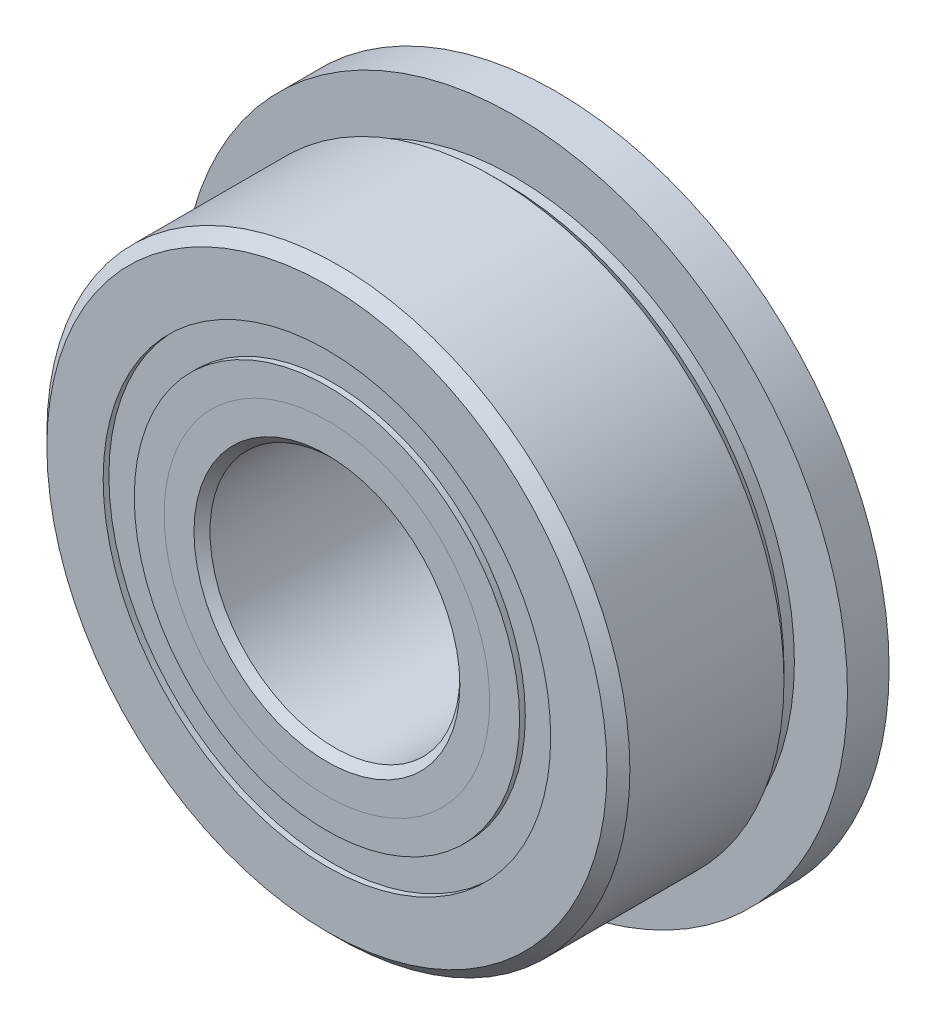
ISO-10303-21;
HEADER;
FILE_DESCRIPTION(('STEP AP214'),'2;1');
FILE_NAME('part.step','',(''),(''),'','','');
FILE_SCHEMA(('AUTOMOTIVE_DESIGN { 1 0 10303 214 1 1 1 1 }'));
ENDSEC;
DATA;
#1=APPLICATION_CONTEXT('core data for automotive mechanical design processes');
#2=APPLICATION_PROTOCOL_DEFINITION('international standard','automotive_design',2000,#1);
#3=PRODUCT_CONTEXT('',#1,'mechanical');
#4=PRODUCT('Part','Part','',(#3));
#5=PRODUCT_RELATED_PRODUCT_CATEGORY('part','',(#4));
#6=PRODUCT_DEFINITION_FORMATION('','',#4);
#7=PRODUCT_DEFINITION_CONTEXT('part definition',#1,'design');
#8=PRODUCT_DEFINITION('design','',#6,#7);
#9=PRODUCT_DEFINITION_SHAPE('','',#8);
#10=(LENGTH_UNIT() NAMED_UNIT(*) SI_UNIT(.MILLI.,.METRE.));
#11=(NAMED_UNIT(*) PLANE_ANGLE_UNIT() SI_UNIT($,.RADIAN.));
#12=(NAMED_UNIT(*) SI_UNIT($,.STERADIAN.) SOLID_ANGLE_UNIT());
#13=UNCERTAINTY_MEASURE_WITH_UNIT(LENGTH_MEASURE(1.E-05),#10,'distance_accuracy_value','');
#14=(GEOMETRIC_REPRESENTATION_CONTEXT(3) GLOBAL_UNCERTAINTY_ASSIGNED_CONTEXT((#13)) GLOBAL_UNIT_ASSIGNED_CONTEXT((#10,
#11,#12)) REPRESENTATION_CONTEXT('',''));
#15=CARTESIAN_POINT('',(0.,0.,0.));
#16=DIRECTION('',(0.,0.,1.));
#17=DIRECTION('',(1.,0.,0.));
#18=AXIS2_PLACEMENT_3D('',#15,#16,#17);
#19=CARTESIAN_POINT('',(0.,8.53063186813187,-4.14734375));
#20=DIRECTION('',(0.,0.,1.));
#21=DIRECTION('',(1.,0.,0.));
#22=AXIS2_PLACEMENT_3D('',#19,#20,#21);
#23=PLANE('',#22);
#24=CARTESIAN_POINT('',(0.,0.,-4.14734375));
#25=DIRECTION('',(0.,0.,1.));
#26=DIRECTION('',(1.,0.,0.));
#27=AXIS2_PLACEMENT_3D('',#24,#25,#26);
#28=CIRCLE('',#27,8.53063186813187);
#29=CARTESIAN_POINT('',(8.53063186813187,0.,-4.14734375));
#30=VERTEX_POINT('',#29);
#31=EDGE_CURVE('E60',#30,#30,#28,.T.);
#32=ORIENTED_EDGE('',*,*,#31,.F.);
#33=EDGE_LOOP('',(#32));
#34=FACE_BOUND('',#33,.T.);
#35=CARTESIAN_POINT('',(0.,0.,-4.14734375));
#36=DIRECTION('',(0.,0.,1.));
#37=DIRECTION('',(1.,0.,0.));
#38=AXIS2_PLACEMENT_3D('',#35,#36,#37);
#39=CIRCLE('',#38,5.9563);
#40=CARTESIAN_POINT('',(5.9563,0.,-4.14734375));
#41=VERTEX_POINT('',#40);
#42=EDGE_CURVE('E11',#41,#41,#39,.T.);
#43=ORIENTED_EDGE('',*,*,#42,.T.);
#44=EDGE_LOOP('',(#43));
#45=FACE_BOUND('',#44,.T.);
#46=ADVANCED_FACE('F46',(#34,#45),#23,.F.);
#47=CARTESIAN_POINT('',(0.,0.,4.365625));
#48=DIRECTION('',(0.,0.,1.));
#49=DIRECTION('',(1.,0.,0.));
#50=AXIS2_PLACEMENT_3D('',#47,#48,#49);
#51=CYLINDRICAL_SURFACE('',#50,5.9563);
#52=ORIENTED_EDGE('',*,*,#42,.F.);
#53=EDGE_LOOP('',(#52));
#54=FACE_BOUND('',#53,.T.);
#55=CARTESIAN_POINT('',(0.,0.,-2.56418571825199));
#56=DIRECTION('',(0.,0.,1.));
#57=DIRECTION('',(1.,0.,0.));
#58=AXIS2_PLACEMENT_3D('',#55,#56,#57);
#59=CIRCLE('',#58,5.9563);
#60=CARTESIAN_POINT('',(5.9563,0.,-2.56418571825199));
#61=VERTEX_POINT('',#60);
#62=EDGE_CURVE('E52',#61,#61,#59,.T.);
#63=ORIENTED_EDGE('',*,*,#62,.T.);
#64=EDGE_LOOP('',(#63));
#65=FACE_BOUND('',#64,.T.);
#66=ADVANCED_FACE('F69',(#54,#65),#51,.F.);
#67=CARTESIAN_POINT('',(0.,8.53063186813187,-2.56418571825199));
#68=DIRECTION('',(0.,0.,-1.));
#69=DIRECTION('',(-1.,0.,0.));
#70=AXIS2_PLACEMENT_3D('',#67,#68,#69);
#71=PLANE('',#70);
#72=ORIENTED_EDGE('',*,*,#62,.F.);
#73=EDGE_LOOP('',(#72));
#74=FACE_BOUND('',#73,.T.);
#75=CARTESIAN_POINT('',(0.,0.,-2.56418571825199));
#76=DIRECTION('',(0.,0.,1.));
#77=DIRECTION('',(1.,0.,0.));
#78=AXIS2_PLACEMENT_3D('',#75,#76,#77);
#79=CIRCLE('',#78,8.53063186813187);
#80=CARTESIAN_POINT('',(8.53063186813187,0.,-2.56418571825199));
#81=VERTEX_POINT('',#80);
#82=EDGE_CURVE('E56',#81,#81,#79,.T.);
#83=ORIENTED_EDGE('',*,*,#82,.T.);
#84=EDGE_LOOP('',(#83));
#85=FACE_BOUND('',#84,.T.);
#86=ADVANCED_FACE('F73',(#74,#85),#71,.F.);
#87=CARTESIAN_POINT('',(0.,0.,4.365625));
#88=DIRECTION('',(0.,0.,1.));
#89=DIRECTION('',(1.,0.,0.));
#90=AXIS2_PLACEMENT_3D('',#87,#88,#89);
#91=CYLINDRICAL_SURFACE('',#90,8.53063186813187);
#92=ORIENTED_EDGE('',*,*,#82,.F.);
#93=EDGE_LOOP('',(#92));
#94=FACE_BOUND('',#93,.T.);
#95=ORIENTED_EDGE('',*,*,#31,.T.);
#96=EDGE_LOOP('',(#95));
#97=FACE_BOUND('',#96,.T.);
#98=ADVANCED_FACE('F66',(#94,#97),#91,.T.);
#99=CLOSED_SHELL('',(#46,#66,#86,#98));
#100=MANIFOLD_SOLID_BREP('B2',#99);
#101=CARTESIAN_POINT('',(0.,8.53063186813187,4.14734375));
#102=DIRECTION('',(0.,0.,-1.));
#103=DIRECTION('',(-1.,0.,0.));
#104=AXIS2_PLACEMENT_3D('',#101,#102,#103);
#105=PLANE('',#104);
#106=CARTESIAN_POINT('',(0.,0.,4.14734375));
#107=DIRECTION('',(0.,0.,1.));
#108=DIRECTION('',(1.,0.,0.));
#109=AXIS2_PLACEMENT_3D('',#106,#107,#108);
#110=CIRCLE('',#109,7.34436813186813);
#111=CARTESIAN_POINT('',(7.34436813186813,0.,4.14734375));
#112=VERTEX_POINT('',#111);
#113=EDGE_CURVE('E45',#112,#112,#110,.T.);
#114=ORIENTED_EDGE('',*,*,#113,.F.);
#115=EDGE_LOOP('',(#114));
#116=FACE_BOUND('',#115,.T.);
#117=CARTESIAN_POINT('',(0.,0.,4.14734375));
#118=DIRECTION('',(0.,0.,1.));
#119=DIRECTION('',(1.,0.,0.));
#120=AXIS2_PLACEMENT_3D('',#117,#118,#119);
#121=CIRCLE('',#120,8.53063186813187);
#122=CARTESIAN_POINT('',(8.53063186813187,0.,4.14734375));
#123=VERTEX_POINT('',#122);
#124=EDGE_CURVE('E130',#123,#123,#121,.T.);
#125=ORIENTED_EDGE('',*,*,#124,.T.);
#126=EDGE_LOOP('',(#125));
#127=FACE_BOUND('',#126,.T.);
#128=ADVANCED_FACE('F116',(#116,#127),#105,.F.);
#129=CARTESIAN_POINT('',(0.,0.,4.365625));
#130=DIRECTION('',(0.,0.,1.));
#131=DIRECTION('',(1.,0.,0.));
#132=AXIS2_PLACEMENT_3D('',#129,#130,#131);
#133=CYLINDRICAL_SURFACE('',#132,7.34436813186813);
#134=CARTESIAN_POINT('',(0.,0.,2.56418571825199));
#135=DIRECTION('',(0.,0.,1.));
#136=DIRECTION('',(1.,0.,0.));
#137=AXIS2_PLACEMENT_3D('',#134,#135,#136);
#138=CIRCLE('',#137,7.34436813186813);
#139=CARTESIAN_POINT('',(7.34436813186813,0.,2.56418571825199));
#140=VERTEX_POINT('',#139);
#141=EDGE_CURVE('E122',#140,#140,#138,.T.);
#142=ORIENTED_EDGE('',*,*,#141,.F.);
#143=EDGE_LOOP('',(#142));
#144=FACE_BOUND('',#143,.T.);
#145=ORIENTED_EDGE('',*,*,#113,.T.);
#146=EDGE_LOOP('',(#145));
#147=FACE_BOUND('',#146,.T.);
#148=ADVANCED_FACE('F145',(#144,#147),#133,.F.);
#149=CARTESIAN_POINT('',(0.,8.53063186813187,2.56418571825199));
#150=DIRECTION('',(0.,0.,1.));
#151=DIRECTION('',(1.,0.,0.));
#152=AXIS2_PLACEMENT_3D('',#149,#150,#151);
#153=PLANE('',#152);
#154=CARTESIAN_POINT('',(0.,0.,2.56418571825199));
#155=DIRECTION('',(0.,0.,1.));
#156=DIRECTION('',(1.,0.,0.));
#157=AXIS2_PLACEMENT_3D('',#154,#155,#156);
#158=CIRCLE('',#157,8.53063186813187);
#159=CARTESIAN_POINT('',(8.53063186813187,0.,2.56418571825199));
#160=VERTEX_POINT('',#159);
#161=EDGE_CURVE('E126',#160,#160,#158,.T.);
#162=ORIENTED_EDGE('',*,*,#161,.F.);
#163=EDGE_LOOP('',(#162));
#164=FACE_BOUND('',#163,.T.);
#165=ORIENTED_EDGE('',*,*,#141,.T.);
#166=EDGE_LOOP('',(#165));
#167=FACE_BOUND('',#166,.T.);
#168=ADVANCED_FACE('F140',(#164,#167),#153,.F.);
#169=CARTESIAN_POINT('',(0.,0.,4.365625));
#170=DIRECTION('',(0.,0.,1.));
#171=DIRECTION('',(1.,0.,0.));
#172=AXIS2_PLACEMENT_3D('',#169,#170,#171);
#173=CYLINDRICAL_SURFACE('',#172,8.53063186813187);
#174=ORIENTED_EDGE('',*,*,#124,.F.);
#175=EDGE_LOOP('',(#174));
#176=FACE_BOUND('',#175,.T.);
#177=ORIENTED_EDGE('',*,*,#161,.T.);
#178=EDGE_LOOP('',(#177));
#179=FACE_BOUND('',#178,.T.);
#180=ADVANCED_FACE('F137',(#176,#179),#173,.T.);
#181=CLOSED_SHELL('',(#128,#148,#168,#180));
#182=MANIFOLD_SOLID_BREP('B6',#181);
#183=CARTESIAN_POINT('',(-3.96874999999991,6.87407664253903,0.));
#184=DIRECTION('',(0.,0.,1.));
#185=DIRECTION('',(-0.499999999999989,0.866025403784445,0.));
#186=AXIS2_PLACEMENT_3D('',#183,#184,#185);
#187=SPHERICAL_SURFACE('',#186,2.56418571825199);
#188=CARTESIAN_POINT('',(-3.96874999999991,6.87407664253903,2.56418571825199));
#189=VERTEX_POINT('',#188);
#190=VERTEX_LOOP('',#189);
#191=FACE_BOUND('',#190,.T.);
#192=ADVANCED_FACE('F186',(#191),#187,.T.);
#193=CLOSED_SHELL('',(#192));
#194=MANIFOLD_SOLID_BREP('B40',#193);
#195=CARTESIAN_POINT('',(-6.87407664253894,3.96875000000008,0.));
#196=DIRECTION('',(0.,0.,1.));
#197=DIRECTION('',(-0.866025403784433,0.50000000000001,0.));
#198=AXIS2_PLACEMENT_3D('',#195,#196,#197);
#199=SPHERICAL_SURFACE('',#198,2.56418571825199);
#200=CARTESIAN_POINT('',(-6.87407664253894,3.96875000000008,2.56418571825199));
#201=VERTEX_POINT('',#200);
#202=VERTEX_LOOP('',#201);
#203=FACE_BOUND('',#202,.T.);
#204=ADVANCED_FACE('F221',(#203),#199,.T.);
#205=CLOSED_SHELL('',(#204));
#206=MANIFOLD_SOLID_BREP('B112',#205);
#207=CARTESIAN_POINT('',(-7.9375,0.,0.));
#208=DIRECTION('',(0.,0.,1.));
#209=DIRECTION('',(-1.,0.,0.));
#210=AXIS2_PLACEMENT_3D('',#207,#208,#209);
#211=SPHERICAL_SURFACE('',#210,2.56418571825199);
#212=CARTESIAN_POINT('',(-7.9375,0.,2.56418571825199));
#213=VERTEX_POINT('',#212);
#214=VERTEX_LOOP('',#213);
#215=FACE_BOUND('',#214,.T.);
#216=ADVANCED_FACE('F256',(#215),#211,.T.);
#217=CLOSED_SHELL('',(#216));
#218=MANIFOLD_SOLID_BREP('B182',#217);
#219=CARTESIAN_POINT('',(-6.87407664253902,-3.96874999999994,0.));
#220=DIRECTION('',(0.,0.,1.));
#221=DIRECTION('',(-0.866025403784443,-0.499999999999992,0.));
#222=AXIS2_PLACEMENT_3D('',#219,#220,#221);
#223=SPHERICAL_SURFACE('',#222,2.56418571825199);
#224=CARTESIAN_POINT('',(-6.87407664253902,-3.96874999999994,2.56418571825199));
#225=VERTEX_POINT('',#224);
#226=VERTEX_LOOP('',#225);
#227=FACE_BOUND('',#226,.T.);
#228=ADVANCED_FACE('F291',(#227),#223,.T.);
#229=CLOSED_SHELL('',(#228));
#230=MANIFOLD_SOLID_BREP('B217',#229);
#231=CARTESIAN_POINT('',(-3.96875000000006,-6.87407664253895,0.));
#232=DIRECTION('',(0.,0.,1.));
#233=DIRECTION('',(-0.500000000000007,-0.866025403784435,0.));
#234=AXIS2_PLACEMENT_3D('',#231,#232,#233);
#235=SPHERICAL_SURFACE('',#234,2.56418571825199);
#236=CARTESIAN_POINT('',(-3.96875000000006,-6.87407664253895,2.56418571825199));
#237=VERTEX_POINT('',#236);
#238=VERTEX_LOOP('',#237);
#239=FACE_BOUND('',#238,.T.);
#240=ADVANCED_FACE('F323',(#239),#235,.T.);
#241=CLOSED_SHELL('',(#240));
#242=MANIFOLD_SOLID_BREP('B252',#241);
#243=CARTESIAN_POINT('',(0.,-7.9375,0.));
#244=DIRECTION('',(0.,0.,1.));
#245=DIRECTION('',(0.,-1.,0.));
#246=AXIS2_PLACEMENT_3D('',#243,#244,#245);
#247=SPHERICAL_SURFACE('',#246,2.56418571825199);
#248=CARTESIAN_POINT('',(0.,-7.9375,2.56418571825199));
#249=VERTEX_POINT('',#248);
#250=VERTEX_LOOP('',#249);
#251=FACE_BOUND('',#250,.T.);
#252=ADVANCED_FACE('F352',(#251),#247,.T.);
#253=CLOSED_SHELL('',(#252));
#254=MANIFOLD_SOLID_BREP('B287',#253);
#255=CARTESIAN_POINT('',(3.96874999999996,-6.87407664253901,0.));
#256=DIRECTION('',(0.,0.,1.));
#257=DIRECTION('',(0.499999999999995,-0.866025403784442,0.));
#258=AXIS2_PLACEMENT_3D('',#255,#256,#257);
#259=SPHERICAL_SURFACE('',#258,2.56418571825199);
#260=CARTESIAN_POINT('',(3.96874999999996,-6.87407664253901,2.56418571825199));
#261=VERTEX_POINT('',#260);
#262=VERTEX_LOOP('',#261);
#263=FACE_BOUND('',#262,.T.);
#264=ADVANCED_FACE('F381',(#263),#259,.T.);
#265=CLOSED_SHELL('',(#264));
#266=MANIFOLD_SOLID_BREP('B319',#265);
#267=CARTESIAN_POINT('',(6.87407664253896,-3.96875000000003,0.));
#268=DIRECTION('',(0.,0.,1.));
#269=DIRECTION('',(0.866025403784436,-0.500000000000004,0.));
#270=AXIS2_PLACEMENT_3D('',#267,#268,#269);
#271=SPHERICAL_SURFACE('',#270,2.56418571825199);
#272=CARTESIAN_POINT('',(6.87407664253896,-3.96875000000003,2.56418571825199));
#273=VERTEX_POINT('',#272);
#274=VERTEX_LOOP('',#273);
#275=FACE_BOUND('',#274,.T.);
#276=ADVANCED_FACE('F410',(#275),#271,.T.);
#277=CLOSED_SHELL('',(#276));
#278=MANIFOLD_SOLID_BREP('B348',#277);
#279=CARTESIAN_POINT('',(7.9375,0.,0.));
#280=DIRECTION('',(0.,0.,1.));
#281=DIRECTION('',(1.,0.,0.));
#282=AXIS2_PLACEMENT_3D('',#279,#280,#281);
#283=SPHERICAL_SURFACE('',#282,2.56418571825199);
#284=CARTESIAN_POINT('',(7.9375,0.,2.56418571825199));
#285=VERTEX_POINT('',#284);
#286=VERTEX_LOOP('',#285);
#287=FACE_BOUND('',#286,.T.);
#288=ADVANCED_FACE('F442',(#287),#283,.T.);
#289=CLOSED_SHELL('',(#288));
#290=MANIFOLD_SOLID_BREP('B377',#289);
#291=CARTESIAN_POINT('',(6.87407664253899,3.96874999999998,0.));
#292=DIRECTION('',(0.,0.,1.));
#293=DIRECTION('',(0.86602540378444,0.499999999999998,0.));
#294=AXIS2_PLACEMENT_3D('',#291,#292,#293);
#295=SPHERICAL_SURFACE('',#294,2.56418571825199);
#296=CARTESIAN_POINT('',(6.87407664253899,3.96874999999998,2.56418571825199));
#297=VERTEX_POINT('',#296);
#298=VERTEX_LOOP('',#297);
#299=FACE_BOUND('',#298,.T.);
#300=ADVANCED_FACE('F477',(#299),#295,.T.);
#301=CLOSED_SHELL('',(#300));
#302=MANIFOLD_SOLID_BREP('B406',#301);
#303=CARTESIAN_POINT('',(3.96875000000001,6.87407664253898,0.));
#304=DIRECTION('',(0.,0.,1.));
#305=DIRECTION('',(0.500000000000001,0.866025403784438,0.));
#306=AXIS2_PLACEMENT_3D('',#303,#304,#305);
#307=SPHERICAL_SURFACE('',#306,2.56418571825199);
#308=CARTESIAN_POINT('',(3.96875000000001,6.87407664253898,2.56418571825199));
#309=VERTEX_POINT('',#308);
#310=VERTEX_LOOP('',#309);
#311=FACE_BOUND('',#310,.T.);
#312=ADVANCED_FACE('F509',(#311),#307,.T.);
#313=CLOSED_SHELL('',(#312));
#314=MANIFOLD_SOLID_BREP('B438',#313);
#315=CARTESIAN_POINT('',(0.,7.9375,0.));
#316=DIRECTION('',(0.,0.,1.));
#317=DIRECTION('',(0.,1.,0.));
#318=AXIS2_PLACEMENT_3D('',#315,#316,#317);
#319=SPHERICAL_SURFACE('',#318,2.56418571825199);
#320=CARTESIAN_POINT('',(0.,7.9375,2.56418571825199));
#321=VERTEX_POINT('',#320);
#322=VERTEX_LOOP('',#321);
#323=FACE_BOUND('',#322,.T.);
#324=ADVANCED_FACE('F543',(#323),#319,.T.);
#325=CLOSED_SHELL('',(#324));
#326=MANIFOLD_SOLID_BREP('B473',#325);
#327=CARTESIAN_POINT('',(0.,6.20613763637107,4.365625));
#328=DIRECTION('',(0.,0.,-1.));
#329=DIRECTION('',(-1.,0.,0.));
#330=AXIS2_PLACEMENT_3D('',#327,#328,#329);
#331=PLANE('',#330);
#332=CARTESIAN_POINT('',(0.,0.,4.365625));
#333=DIRECTION('',(0.,0.,1.));
#334=DIRECTION('',(1.,0.,0.));
#335=AXIS2_PLACEMENT_3D('',#332,#333,#334);
#336=CIRCLE('',#335,5.067907140874);
#337=CARTESIAN_POINT('',(5.067907140874,0.,4.365625));
#338=VERTEX_POINT('',#337);
#339=EDGE_CURVE('E600',#338,#338,#336,.T.);
#340=ORIENTED_EDGE('',*,*,#339,.F.);
#341=EDGE_LOOP('',(#340));
#342=FACE_BOUND('',#341,.T.);
#343=CARTESIAN_POINT('',(0.,0.,4.365625));
#344=DIRECTION('',(0.,0.,1.));
#345=DIRECTION('',(1.,0.,0.));
#346=AXIS2_PLACEMENT_3D('',#343,#344,#345);
#347=CIRCLE('',#346,6.20613763637107);
#348=CARTESIAN_POINT('',(6.20613763637107,0.,4.365625));
#349=VERTEX_POINT('',#348);
#350=EDGE_CURVE('E542',#349,#349,#347,.T.);
#351=ORIENTED_EDGE('',*,*,#350,.T.);
#352=EDGE_LOOP('',(#351));
#353=FACE_BOUND('',#352,.T.);
#354=ADVANCED_FACE('F566',(#342,#353),#331,.F.);
#355=CARTESIAN_POINT('',(0.,0.,3.22739450450294));
#356=DIRECTION('',(0.,0.,1.));
#357=DIRECTION('',(1.,0.,0.));
#358=AXIS2_PLACEMENT_3D('',#355,#356,#357);
#359=CONICAL_SURFACE('',#358,5.067907140874,0.78539816339745);
#360=ORIENTED_EDGE('',*,*,#350,.F.);
#361=EDGE_LOOP('',(#360));
#362=FACE_BOUND('',#361,.T.);
#363=CARTESIAN_POINT('',(0.,0.,3.22739450450294));
#364=DIRECTION('',(0.,0.,1.));
#365=DIRECTION('',(1.,0.,0.));
#366=AXIS2_PLACEMENT_3D('',#363,#364,#365);
#367=CIRCLE('',#366,5.067907140874);
#368=CARTESIAN_POINT('',(5.067907140874,0.,3.22739450450294));
#369=VERTEX_POINT('',#368);
#370=EDGE_CURVE('E572',#369,#369,#367,.T.);
#371=ORIENTED_EDGE('',*,*,#370,.T.);
#372=EDGE_LOOP('',(#371));
#373=FACE_BOUND('',#372,.T.);
#374=ADVANCED_FACE('F607',(#362,#373),#359,.T.);
#375=CARTESIAN_POINT('',(0.,0.,4.365625));
#376=DIRECTION('',(0.,0.,1.));
#377=DIRECTION('',(1.,0.,0.));
#378=AXIS2_PLACEMENT_3D('',#375,#376,#377);
#379=CYLINDRICAL_SURFACE('',#378,5.067907140874);
#380=ORIENTED_EDGE('',*,*,#370,.F.);
#381=EDGE_LOOP('',(#380));
#382=FACE_BOUND('',#381,.T.);
#383=CARTESIAN_POINT('',(0.,0.,0.));
#384=DIRECTION('',(0.,0.,1.));
#385=DIRECTION('',(1.,0.,0.));
#386=AXIS2_PLACEMENT_3D('',#383,#384,#385);
#387=CIRCLE('',#386,5.067907140874);
#388=CARTESIAN_POINT('',(5.067907140874,0.,0.));
#389=VERTEX_POINT('',#388);
#390=EDGE_CURVE('E576',#389,#389,#387,.T.);
#391=ORIENTED_EDGE('',*,*,#390,.T.);
#392=EDGE_LOOP('',(#391));
#393=FACE_BOUND('',#392,.T.);
#394=ADVANCED_FACE('F611',(#382,#393),#379,.T.);
#395=CARTESIAN_POINT('',(0.,5.067907140874,0.));
#396=DIRECTION('',(0.,0.,-1.));
#397=DIRECTION('',(-1.,0.,0.));
#398=AXIS2_PLACEMENT_3D('',#395,#396,#397);
#399=PLANE('',#398);
#400=ORIENTED_EDGE('',*,*,#390,.F.);
#401=EDGE_LOOP('',(#400));
#402=FACE_BOUND('',#401,.T.);
#403=CARTESIAN_POINT('',(0.,0.,0.));
#404=DIRECTION('',(0.,0.,1.));
#405=DIRECTION('',(1.,0.,0.));
#406=AXIS2_PLACEMENT_3D('',#403,#404,#405);
#407=CIRCLE('',#406,5.37331428174801);
#408=CARTESIAN_POINT('',(5.37331428174801,0.,0.));
#409=VERTEX_POINT('',#408);
#410=EDGE_CURVE('E580',#409,#409,#407,.T.);
#411=ORIENTED_EDGE('',*,*,#410,.T.);
#412=EDGE_LOOP('',(#411));
#413=FACE_BOUND('',#412,.T.);
#414=ADVANCED_FACE('F616',(#402,#413),#399,.F.);
#415=CARTESIAN_POINT('',(0.,0.,0.));
#416=DIRECTION('',(0.,0.,1.));
#417=DIRECTION('',(1.,0.,0.));
#418=AXIS2_PLACEMENT_3D('',#415,#416,#417);
#419=TOROIDAL_SURFACE('',#418,7.9375,2.56418571825199);
#420=ORIENTED_EDGE('',*,*,#410,.F.);
#421=EDGE_LOOP('',(#420));
#422=FACE_BOUND('',#421,.T.);
#423=CARTESIAN_POINT('',(0.,0.,-1.62784979580042));
#424=DIRECTION('',(0.,0.,1.));
#425=DIRECTION('',(1.,0.,0.));
#426=AXIS2_PLACEMENT_3D('',#423,#424,#425);
#427=CIRCLE('',#426,5.9563);
#428=CARTESIAN_POINT('',(5.9563,0.,-1.62784979580042));
#429=VERTEX_POINT('',#428);
#430=EDGE_CURVE('E585',#429,#429,#427,.T.);
#431=ORIENTED_EDGE('',*,*,#430,.T.);
#432=EDGE_LOOP('',(#431));
#433=FACE_BOUND('',#432,.T.);
#434=ADVANCED_FACE('F622',(#422,#433),#419,.F.);
#435=CARTESIAN_POINT('',(0.,0.,4.365625));
#436=DIRECTION('',(0.,0.,1.));
#437=DIRECTION('',(1.,0.,0.));
#438=AXIS2_PLACEMENT_3D('',#435,#436,#437);
#439=CYLINDRICAL_SURFACE('',#438,5.9563);
#440=ORIENTED_EDGE('',*,*,#430,.F.);
#441=EDGE_LOOP('',(#440));
#442=FACE_BOUND('',#441,.T.);
#443=CARTESIAN_POINT('',(0.,0.,-5.953125));
#444=DIRECTION('',(0.,0.,1.));
#445=DIRECTION('',(1.,0.,0.));
#446=AXIS2_PLACEMENT_3D('',#443,#444,#445);
#447=CIRCLE('',#446,5.9563);
#448=CARTESIAN_POINT('',(5.9563,0.,-5.953125));
#449=VERTEX_POINT('',#448);
#450=EDGE_CURVE('E588',#449,#449,#447,.T.);
#451=ORIENTED_EDGE('',*,*,#450,.T.);
#452=EDGE_LOOP('',(#451));
#453=FACE_BOUND('',#452,.T.);
#454=ADVANCED_FACE('F626',(#442,#453),#439,.T.);
#455=CARTESIAN_POINT('',(0.,5.1990625,-5.953125));
#456=DIRECTION('',(0.,0.,1.));
#457=DIRECTION('',(1.,0.,0.));
#458=AXIS2_PLACEMENT_3D('',#455,#456,#457);
#459=PLANE('',#458);
#460=ORIENTED_EDGE('',*,*,#450,.F.);
#461=EDGE_LOOP('',(#460));
#462=FACE_BOUND('',#461,.T.);
#463=CARTESIAN_POINT('',(0.,0.,-5.953125));
#464=DIRECTION('',(0.,0.,1.));
#465=DIRECTION('',(1.,0.,0.));
#466=AXIS2_PLACEMENT_3D('',#463,#464,#465);
#467=CIRCLE('',#466,5.1990625);
#468=CARTESIAN_POINT('',(5.1990625,0.,-5.953125));
#469=VERTEX_POINT('',#468);
#470=EDGE_CURVE('E591',#469,#469,#467,.T.);
#471=ORIENTED_EDGE('',*,*,#470,.T.);
#472=EDGE_LOOP('',(#471));
#473=FACE_BOUND('',#472,.T.);
#474=ADVANCED_FACE('F630',(#462,#473),#459,.F.);
#475=CARTESIAN_POINT('',(0.,0.,-5.5165625));
#476=DIRECTION('',(0.,0.,-1.));
#477=DIRECTION('',(-1.,0.,0.));
#478=AXIS2_PLACEMENT_3D('',#475,#476,#477);
#479=CONICAL_SURFACE('',#478,4.7625,0.785398163397444);
#480=ORIENTED_EDGE('',*,*,#470,.F.);
#481=EDGE_LOOP('',(#480));
#482=FACE_BOUND('',#481,.T.);
#483=CARTESIAN_POINT('',(0.,0.,-5.5165625));
#484=DIRECTION('',(0.,0.,1.));
#485=DIRECTION('',(1.,0.,0.));
#486=AXIS2_PLACEMENT_3D('',#483,#484,#485);
#487=CIRCLE('',#486,4.7625);
#488=CARTESIAN_POINT('',(4.7625,0.,-5.5165625));
#489=VERTEX_POINT('',#488);
#490=EDGE_CURVE('E594',#489,#489,#487,.T.);
#491=ORIENTED_EDGE('',*,*,#490,.T.);
#492=EDGE_LOOP('',(#491));
#493=FACE_BOUND('',#492,.T.);
#494=ADVANCED_FACE('F634',(#482,#493),#479,.F.);
#495=CARTESIAN_POINT('',(0.,0.,4.365625));
#496=DIRECTION('',(0.,0.,1.));
#497=DIRECTION('',(1.,0.,0.));
#498=AXIS2_PLACEMENT_3D('',#495,#496,#497);
#499=CYLINDRICAL_SURFACE('',#498,4.7625);
#500=ORIENTED_EDGE('',*,*,#490,.F.);
#501=EDGE_LOOP('',(#500));
#502=FACE_BOUND('',#501,.T.);
#503=CARTESIAN_POINT('',(0.,0.,4.060217859126));
#504=DIRECTION('',(0.,0.,1.));
#505=DIRECTION('',(1.,0.,0.));
#506=AXIS2_PLACEMENT_3D('',#503,#504,#505);
#507=CIRCLE('',#506,4.7625);
#508=CARTESIAN_POINT('',(4.7625,0.,4.060217859126));
#509=VERTEX_POINT('',#508);
#510=EDGE_CURVE('E597',#509,#509,#507,.T.);
#511=ORIENTED_EDGE('',*,*,#510,.T.);
#512=EDGE_LOOP('',(#511));
#513=FACE_BOUND('',#512,.T.);
#514=ADVANCED_FACE('F638',(#502,#513),#499,.F.);
#515=CARTESIAN_POINT('',(0.,0.,4.365625));
#516=DIRECTION('',(0.,0.,1.));
#517=DIRECTION('',(1.,0.,0.));
#518=AXIS2_PLACEMENT_3D('',#515,#516,#517);
#519=CONICAL_SURFACE('',#518,5.067907140874,0.785398163397451);
#520=ORIENTED_EDGE('',*,*,#510,.F.);
#521=EDGE_LOOP('',(#520));
#522=FACE_BOUND('',#521,.T.);
#523=ORIENTED_EDGE('',*,*,#339,.T.);
#524=EDGE_LOOP('',(#523));
#525=FACE_BOUND('',#524,.T.);
#526=ADVANCED_FACE('F604',(#522,#525),#519,.F.);
#527=CLOSED_SHELL('',(#354,#374,#394,#414,#434,#454,#474,#494,#514,#526));
#528=MANIFOLD_SOLID_BREP('B505',#527);
#529=CARTESIAN_POINT('',(0.,7.34436813186813,4.365625));
#530=DIRECTION('',(0.,0.,-1.));
#531=DIRECTION('',(-1.,0.,0.));
#532=AXIS2_PLACEMENT_3D('',#529,#530,#531);
#533=PLANE('',#532);
#534=CARTESIAN_POINT('',(0.,0.,4.365625));
#535=DIRECTION('',(0.,0.,1.));
#536=DIRECTION('',(1.,0.,0.));
#537=AXIS2_PLACEMENT_3D('',#534,#535,#536);
#538=CIRCLE('',#537,6.20613763637107);
#539=CARTESIAN_POINT('',(6.20613763637107,0.,4.365625));
#540=VERTEX_POINT('',#539);
#541=EDGE_CURVE('E565',#540,#540,#538,.T.);
#542=ORIENTED_EDGE('',*,*,#541,.F.);
#543=EDGE_LOOP('',(#542));
#544=FACE_BOUND('',#543,.T.);
#545=CARTESIAN_POINT('',(0.,0.,4.365625));
#546=DIRECTION('',(0.,0.,1.));
#547=DIRECTION('',(1.,0.,0.));
#548=AXIS2_PLACEMENT_3D('',#545,#546,#547);
#549=CIRCLE('',#548,7.34436813186813);
#550=CARTESIAN_POINT('',(7.34436813186813,0.,4.365625));
#551=VERTEX_POINT('',#550);
#552=EDGE_CURVE('E749',#551,#551,#549,.T.);
#553=ORIENTED_EDGE('',*,*,#552,.T.);
#554=EDGE_LOOP('',(#553));
#555=FACE_BOUND('',#554,.T.);
#556=ADVANCED_FACE('F727',(#544,#555),#533,.F.);
#557=CARTESIAN_POINT('',(0.,0.,4.365625));
#558=DIRECTION('',(0.,0.,1.));
#559=DIRECTION('',(1.,0.,0.));
#560=AXIS2_PLACEMENT_3D('',#557,#558,#559);
#561=CONICAL_SURFACE('',#560,6.20613763637107,0.78539816339745);
#562=CARTESIAN_POINT('',(0.,0.,3.22739450450294));
#563=DIRECTION('',(0.,0.,1.));
#564=DIRECTION('',(1.,0.,0.));
#565=AXIS2_PLACEMENT_3D('',#562,#563,#564);
#566=CIRCLE('',#565,5.067907140874);
#567=CARTESIAN_POINT('',(5.067907140874,0.,3.22739450450294));
#568=VERTEX_POINT('',#567);
#569=EDGE_CURVE('E733',#568,#568,#566,.T.);
#570=ORIENTED_EDGE('',*,*,#569,.F.);
#571=EDGE_LOOP('',(#570));
#572=FACE_BOUND('',#571,.T.);
#573=ORIENTED_EDGE('',*,*,#541,.T.);
#574=EDGE_LOOP('',(#573));
#575=FACE_BOUND('',#574,.T.);
#576=ADVANCED_FACE('F774',(#572,#575),#561,.F.);
#577=CARTESIAN_POINT('',(0.,0.,4.365625));
#578=DIRECTION('',(0.,0.,1.));
#579=DIRECTION('',(1.,0.,0.));
#580=AXIS2_PLACEMENT_3D('',#577,#578,#579);
#581=CYLINDRICAL_SURFACE('',#580,5.067907140874);
#582=CARTESIAN_POINT('',(0.,0.,0.));
#583=DIRECTION('',(0.,0.,1.));
#584=DIRECTION('',(1.,0.,0.));
#585=AXIS2_PLACEMENT_3D('',#582,#583,#584);
#586=CIRCLE('',#585,5.067907140874);
#587=CARTESIAN_POINT('',(5.067907140874,0.,0.));
#588=VERTEX_POINT('',#587);
#589=EDGE_CURVE('E737',#588,#588,#586,.T.);
#590=ORIENTED_EDGE('',*,*,#589,.F.);
#591=EDGE_LOOP('',(#590));
#592=FACE_BOUND('',#591,.T.);
#593=ORIENTED_EDGE('',*,*,#569,.T.);
#594=EDGE_LOOP('',(#593));
#595=FACE_BOUND('',#594,.T.);
#596=ADVANCED_FACE('F769',(#592,#595),#581,.F.);
#597=CARTESIAN_POINT('',(0.,5.067907140874,0.));
#598=DIRECTION('',(0.,0.,1.));
#599=DIRECTION('',(1.,0.,0.));
#600=AXIS2_PLACEMENT_3D('',#597,#598,#599);
#601=PLANE('',#600);
#602=CARTESIAN_POINT('',(0.,0.,0.));
#603=DIRECTION('',(0.,0.,1.));
#604=DIRECTION('',(1.,0.,0.));
#605=AXIS2_PLACEMENT_3D('',#602,#603,#604);
#606=CIRCLE('',#605,5.37331428174801);
#607=CARTESIAN_POINT('',(5.37331428174801,0.,0.));
#608=VERTEX_POINT('',#607);
#609=EDGE_CURVE('E741',#608,#608,#606,.T.);
#610=ORIENTED_EDGE('',*,*,#609,.F.);
#611=EDGE_LOOP('',(#610));
#612=FACE_BOUND('',#611,.T.);
#613=ORIENTED_EDGE('',*,*,#589,.T.);
#614=EDGE_LOOP('',(#613));
#615=FACE_BOUND('',#614,.T.);
#616=ADVANCED_FACE('F763',(#612,#615),#601,.F.);
#617=CARTESIAN_POINT('',(0.,0.,0.));
#618=DIRECTION('',(0.,0.,1.));
#619=DIRECTION('',(1.,0.,0.));
#620=AXIS2_PLACEMENT_3D('',#617,#618,#619);
#621=TOROIDAL_SURFACE('',#620,7.9375,2.56418571825199);
#622=CARTESIAN_POINT('',(0.,0.,2.49464285714286));
#623=DIRECTION('',(0.,0.,1.));
#624=DIRECTION('',(1.,0.,0.));
#625=AXIS2_PLACEMENT_3D('',#622,#623,#624);
#626=CIRCLE('',#625,7.34436813186813);
#627=CARTESIAN_POINT('',(7.34436813186813,0.,2.49464285714286));
#628=VERTEX_POINT('',#627);
#629=EDGE_CURVE('E746',#628,#628,#626,.T.);
#630=ORIENTED_EDGE('',*,*,#629,.F.);
#631=EDGE_LOOP('',(#630));
#632=FACE_BOUND('',#631,.T.);
#633=ORIENTED_EDGE('',*,*,#609,.T.);
#634=EDGE_LOOP('',(#633));
#635=FACE_BOUND('',#634,.T.);
#636=ADVANCED_FACE('F757',(#632,#635),#621,.F.);
#637=CARTESIAN_POINT('',(0.,0.,4.365625));
#638=DIRECTION('',(0.,0.,1.));
#639=DIRECTION('',(1.,0.,0.));
#640=AXIS2_PLACEMENT_3D('',#637,#638,#639);
#641=CYLINDRICAL_SURFACE('',#640,7.34436813186813);
#642=ORIENTED_EDGE('',*,*,#552,.F.);
#643=EDGE_LOOP('',(#642));
#644=FACE_BOUND('',#643,.T.);
#645=ORIENTED_EDGE('',*,*,#629,.T.);
#646=EDGE_LOOP('',(#645));
#647=FACE_BOUND('',#646,.T.);
#648=ADVANCED_FACE('F754',(#644,#647),#641,.T.);
#649=CLOSED_SHELL('',(#556,#576,#596,#616,#636,#648));
#650=MANIFOLD_SOLID_BREP('B537',#649);
#651=CARTESIAN_POINT('',(0.,0.,4.365625));
#652=DIRECTION('',(0.,0.,1.));
#653=DIRECTION('',(1.,0.,0.));
#654=AXIS2_PLACEMENT_3D('',#651,#652,#653);
#655=CYLINDRICAL_SURFACE('',#654,11.1125);
#656=CARTESIAN_POINT('',(0.,0.,3.9290625));
#657=DIRECTION('',(0.,0.,1.));
#658=DIRECTION('',(1.,0.,0.));
#659=AXIS2_PLACEMENT_3D('',#656,#657,#658);
#660=CIRCLE('',#659,11.1125);
#661=CARTESIAN_POINT('',(11.1125,0.,3.9290625));
#662=VERTEX_POINT('',#661);
#663=EDGE_CURVE('E726',#662,#662,#660,.T.);
#664=ORIENTED_EDGE('',*,*,#663,.F.);
#665=EDGE_LOOP('',(#664));
#666=FACE_BOUND('',#665,.T.);
#667=CARTESIAN_POINT('',(0.,0.,-1.9446875));
#668=DIRECTION('',(0.,0.,1.));
#669=DIRECTION('',(1.,0.,0.));
#670=AXIS2_PLACEMENT_3D('',#667,#668,#669);
#671=CIRCLE('',#670,11.1125);
#672=CARTESIAN_POINT('',(11.1125,0.,-1.9446875));
#673=VERTEX_POINT('',#672);
#674=EDGE_CURVE('E856',#673,#673,#671,.T.);
#675=ORIENTED_EDGE('',*,*,#674,.T.);
#676=EDGE_LOOP('',(#675));
#677=FACE_BOUND('',#676,.T.);
#678=ADVANCED_FACE('F818',(#666,#677),#655,.T.);
#679=CARTESIAN_POINT('',(0.,0.,3.9290625));
#680=DIRECTION('',(0.,0.,-1.));
#681=DIRECTION('',(-1.,0.,0.));
#682=AXIS2_PLACEMENT_3D('',#679,#680,#681);
#683=CONICAL_SURFACE('',#682,11.1125,0.785398163397451);
#684=CARTESIAN_POINT('',(0.,0.,4.365625));
#685=DIRECTION('',(0.,0.,1.));
#686=DIRECTION('',(1.,0.,0.));
#687=AXIS2_PLACEMENT_3D('',#684,#685,#686);
#688=CIRCLE('',#687,10.6759375);
#689=CARTESIAN_POINT('',(10.6759375,0.,4.365625));
#690=VERTEX_POINT('',#689);
#691=EDGE_CURVE('E841',#690,#690,#688,.T.);
#692=ORIENTED_EDGE('',*,*,#691,.F.);
#693=EDGE_LOOP('',(#692));
#694=FACE_BOUND('',#693,.T.);
#695=ORIENTED_EDGE('',*,*,#663,.T.);
#696=EDGE_LOOP('',(#695));
#697=FACE_BOUND('',#696,.T.);
#698=ADVANCED_FACE('F820',(#694,#697),#683,.T.);
#699=CARTESIAN_POINT('',(0.,10.6759375,-4.365625));
#700=DIRECTION('',(0.,0.,1.));
#701=DIRECTION('',(1.,0.,0.));
#702=AXIS2_PLACEMENT_3D('',#699,#700,#701);
#703=PLANE('',#702);
#704=CARTESIAN_POINT('',(0.,0.,-4.365625));
#705=DIRECTION('',(0.,0.,1.));
#706=DIRECTION('',(1.,0.,0.));
#707=AXIS2_PLACEMENT_3D('',#704,#705,#706);
#708=CIRCLE('',#707,8.53063186813187);
#709=CARTESIAN_POINT('',(8.53063186813187,0.,-4.365625));
#710=VERTEX_POINT('',#709);
#711=EDGE_CURVE('E825',#710,#710,#708,.T.);
#712=ORIENTED_EDGE('',*,*,#711,.T.);
#713=EDGE_LOOP('',(#712));
#714=FACE_BOUND('',#713,.T.);
#715=CARTESIAN_POINT('',(0.,0.,-4.365625));
#716=DIRECTION('',(0.,0.,-1.));
#717=DIRECTION('',(-1.,0.,0.));
#718=AXIS2_PLACEMENT_3D('',#715,#716,#717);
#719=CIRCLE('',#718,12.7);
#720=CARTESIAN_POINT('',(-12.7,0.,-4.365625));
#721=VERTEX_POINT('',#720);
#722=EDGE_CURVE('E844',#721,#721,#719,.T.);
#723=ORIENTED_EDGE('',*,*,#722,.T.);
#724=EDGE_LOOP('',(#723));
#725=FACE_BOUND('',#724,.T.);
#726=ADVANCED_FACE('F877',(#714,#725),#703,.F.);
#727=CARTESIAN_POINT('',(0.,0.,4.365625));
#728=DIRECTION('',(0.,0.,1.));
#729=DIRECTION('',(1.,0.,0.));
#730=AXIS2_PLACEMENT_3D('',#727,#728,#729);
#731=CYLINDRICAL_SURFACE('',#730,8.53063186813187);
#732=ORIENTED_EDGE('',*,*,#711,.F.);
#733=EDGE_LOOP('',(#732));
#734=FACE_BOUND('',#733,.T.);
#735=CARTESIAN_POINT('',(0.,0.,-2.49464285714286));
#736=DIRECTION('',(0.,0.,1.));
#737=DIRECTION('',(1.,0.,0.));
#738=AXIS2_PLACEMENT_3D('',#735,#736,#737);
#739=CIRCLE('',#738,8.53063186813187);
#740=CARTESIAN_POINT('',(8.53063186813187,0.,-2.49464285714286));
#741=VERTEX_POINT('',#740);
#742=EDGE_CURVE('E829',#741,#741,#739,.T.);
#743=ORIENTED_EDGE('',*,*,#742,.T.);
#744=EDGE_LOOP('',(#743));
#745=FACE_BOUND('',#744,.T.);
#746=ADVANCED_FACE('F882',(#734,#745),#731,.F.);
#747=CARTESIAN_POINT('',(0.,0.,0.));
#748=DIRECTION('',(0.,0.,1.));
#749=DIRECTION('',(1.,0.,0.));
#750=AXIS2_PLACEMENT_3D('',#747,#748,#749);
#751=TOROIDAL_SURFACE('',#750,7.9375,2.56418571825199);
#752=ORIENTED_EDGE('',*,*,#742,.F.);
#753=EDGE_LOOP('',(#752));
#754=FACE_BOUND('',#753,.T.);
#755=CARTESIAN_POINT('',(0.,0.,2.49464285714286));
#756=DIRECTION('',(0.,0.,1.));
#757=DIRECTION('',(1.,0.,0.));
#758=AXIS2_PLACEMENT_3D('',#755,#756,#757);
#759=CIRCLE('',#758,8.53063186813187);
#760=CARTESIAN_POINT('',(8.53063186813187,0.,2.49464285714286));
#761=VERTEX_POINT('',#760);
#762=EDGE_CURVE('E833',#761,#761,#759,.T.);
#763=ORIENTED_EDGE('',*,*,#762,.T.);
#764=EDGE_LOOP('',(#763));
#765=FACE_BOUND('',#764,.T.);
#766=ADVANCED_FACE('F885',(#754,#765),#751,.F.);
#767=CARTESIAN_POINT('',(0.,0.,4.365625));
#768=DIRECTION('',(0.,0.,1.));
#769=DIRECTION('',(1.,0.,0.));
#770=AXIS2_PLACEMENT_3D('',#767,#768,#769);
#771=CYLINDRICAL_SURFACE('',#770,8.53063186813187);
#772=ORIENTED_EDGE('',*,*,#762,.F.);
#773=EDGE_LOOP('',(#772));
#774=FACE_BOUND('',#773,.T.);
#775=CARTESIAN_POINT('',(0.,0.,4.365625));
#776=DIRECTION('',(0.,0.,1.));
#777=DIRECTION('',(1.,0.,0.));
#778=AXIS2_PLACEMENT_3D('',#775,#776,#777);
#779=CIRCLE('',#778,8.53063186813187);
#780=CARTESIAN_POINT('',(8.53063186813187,0.,4.365625));
#781=VERTEX_POINT('',#780);
#782=EDGE_CURVE('E838',#781,#781,#779,.T.);
#783=ORIENTED_EDGE('',*,*,#782,.T.);
#784=EDGE_LOOP('',(#783));
#785=FACE_BOUND('',#784,.T.);
#786=ADVANCED_FACE('F889',(#774,#785),#771,.F.);
#787=CARTESIAN_POINT('',(0.,10.6759375,4.365625));
#788=DIRECTION('',(0.,0.,-1.));
#789=DIRECTION('',(-1.,0.,0.));
#790=AXIS2_PLACEMENT_3D('',#787,#788,#789);
#791=PLANE('',#790);
#792=ORIENTED_EDGE('',*,*,#782,.F.);
#793=EDGE_LOOP('',(#792));
#794=FACE_BOUND('',#793,.T.);
#795=ORIENTED_EDGE('',*,*,#691,.T.);
#796=EDGE_LOOP('',(#795));
#797=FACE_BOUND('',#796,.T.);
#798=ADVANCED_FACE('F893',(#794,#797),#791,.F.);
#799=CARTESIAN_POINT('',(0.,9.60328468406593,-2.778125));
#800=DIRECTION('',(0.,0.,1.));
#801=DIRECTION('',(1.,0.,0.));
#802=AXIS2_PLACEMENT_3D('',#799,#800,#801);
#803=PLANE('',#802);
#804=CARTESIAN_POINT('',(0.,0.,-2.77812500000001));
#805=DIRECTION('',(0.,0.,-1.));
#806=DIRECTION('',(-1.,0.,0.));
#807=AXIS2_PLACEMENT_3D('',#804,#805,#806);
#808=CIRCLE('',#807,12.7);
#809=CARTESIAN_POINT('',(-12.7,0.,-2.77812500000001));
#810=VERTEX_POINT('',#809);
#811=EDGE_CURVE('E847',#810,#810,#808,.T.);
#812=ORIENTED_EDGE('',*,*,#811,.F.);
#813=EDGE_LOOP('',(#812));
#814=FACE_BOUND('',#813,.T.);
#815=CARTESIAN_POINT('',(0.,0.,-2.778125));
#816=DIRECTION('',(0.,0.,1.));
#817=DIRECTION('',(1.,0.,0.));
#818=AXIS2_PLACEMENT_3D('',#815,#816,#817);
#819=CIRCLE('',#818,10.6759375);
#820=CARTESIAN_POINT('',(10.6759375,0.,-2.778125));
#821=VERTEX_POINT('',#820);
#822=EDGE_CURVE('E850',#821,#821,#819,.T.);
#823=ORIENTED_EDGE('',*,*,#822,.F.);
#824=EDGE_LOOP('',(#823));
#825=FACE_BOUND('',#824,.T.);
#826=ADVANCED_FACE('F897',(#814,#825),#803,.T.);
#827=CARTESIAN_POINT('',(0.,0.,-5.953125));
#828=DIRECTION('',(0.,0.,-1.));
#829=DIRECTION('',(-1.,0.,0.));
#830=AXIS2_PLACEMENT_3D('',#827,#828,#829);
#831=CYLINDRICAL_SURFACE('',#830,12.7);
#832=ORIENTED_EDGE('',*,*,#811,.T.);
#833=EDGE_LOOP('',(#832));
#834=FACE_BOUND('',#833,.T.);
#835=ORIENTED_EDGE('',*,*,#722,.F.);
#836=EDGE_LOOP('',(#835));
#837=FACE_BOUND('',#836,.T.);
#838=ADVANCED_FACE('F869',(#834,#837),#831,.T.);
#839=CARTESIAN_POINT('',(0.,0.,4.365625));
#840=DIRECTION('',(0.,0.,1.));
#841=DIRECTION('',(1.,0.,0.));
#842=AXIS2_PLACEMENT_3D('',#839,#840,#841);
#843=CYLINDRICAL_SURFACE('',#842,10.6759375);
#844=ORIENTED_EDGE('',*,*,#822,.T.);
#845=EDGE_LOOP('',(#844));
#846=FACE_BOUND('',#845,.T.);
#847=CARTESIAN_POINT('',(0.,0.,-2.38125));
#848=DIRECTION('',(0.,0.,1.));
#849=DIRECTION('',(1.,0.,0.));
#850=AXIS2_PLACEMENT_3D('',#847,#848,#849);
#851=CIRCLE('',#850,10.6759375);
#852=CARTESIAN_POINT('',(10.6759375,0.,-2.38125));
#853=VERTEX_POINT('',#852);
#854=EDGE_CURVE('E853',#853,#853,#851,.T.);
#855=ORIENTED_EDGE('',*,*,#854,.F.);
#856=EDGE_LOOP('',(#855));
#857=FACE_BOUND('',#856,.T.);
#858=ADVANCED_FACE('F863',(#846,#857),#843,.T.);
#859=CARTESIAN_POINT('',(0.,0.,-1.9446875));
#860=DIRECTION('',(0.,0.,1.));
#861=DIRECTION('',(1.,0.,0.));
#862=AXIS2_PLACEMENT_3D('',#859,#860,#861);
#863=CONICAL_SURFACE('',#862,11.1125,0.78539816339745);
#864=ORIENTED_EDGE('',*,*,#854,.T.);
#865=EDGE_LOOP('',(#864));
#866=FACE_BOUND('',#865,.T.);
#867=ORIENTED_EDGE('',*,*,#674,.F.);
#868=EDGE_LOOP('',(#867));
#869=FACE_BOUND('',#868,.T.);
#870=ADVANCED_FACE('F861',(#866,#869),#863,.T.);
#871=CLOSED_SHELL('',(#678,#698,#726,#746,#766,#786,#798,#826,#838,#858,#870));
#872=MANIFOLD_SOLID_BREP('B560',#871);
#873=ADVANCED_BREP_SHAPE_REPRESENTATION('',(#18,#100,#182,#194,#206,#218,#230,#242,#254,#266,
#278,#290,#302,#314,#326,#528,#650,#872),#14);
#874=SHAPE_DEFINITION_REPRESENTATION(#9,#873);
ENDSEC;
END-ISO-10303-21;
